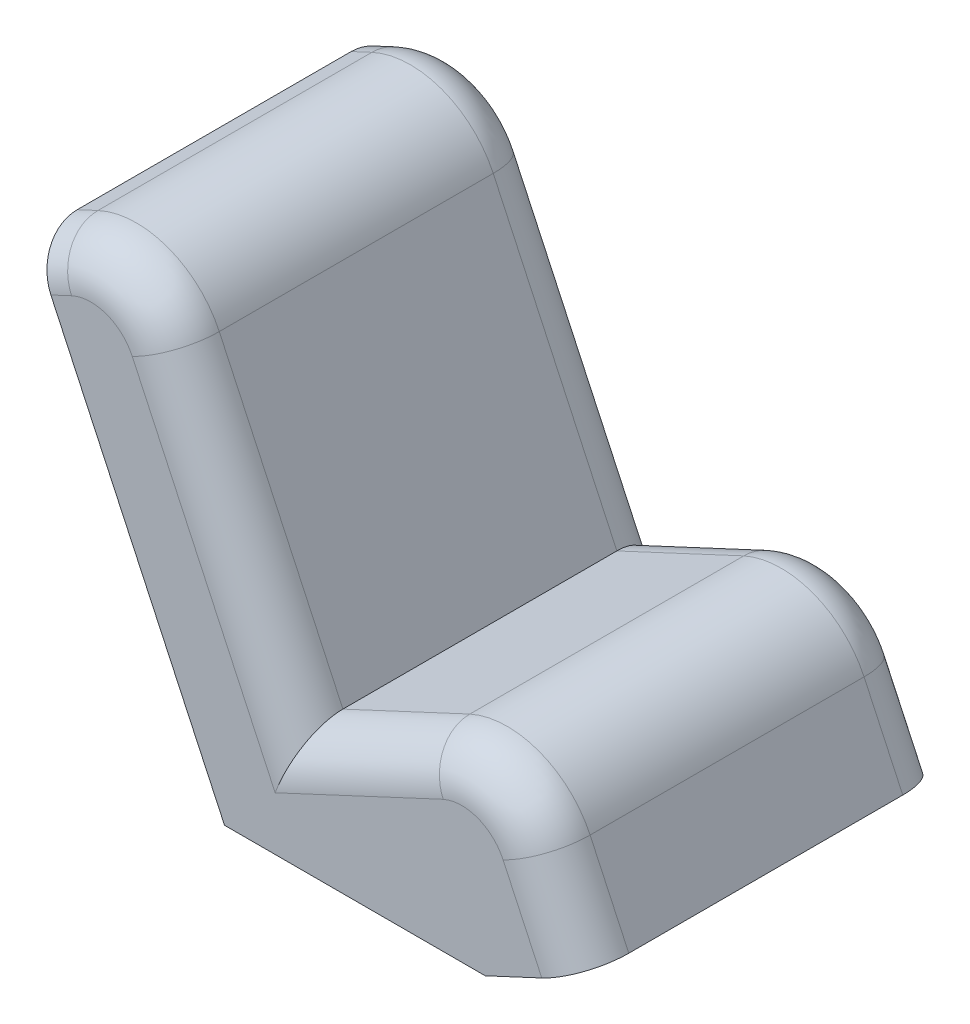
ISO-10303-21;
HEADER;
FILE_DESCRIPTION(('STEP AP214'),'2;1');
FILE_NAME('part.step','',(''),(''),'','','');
FILE_SCHEMA(('AUTOMOTIVE_DESIGN { 1 0 10303 214 1 1 1 1 }'));
ENDSEC;
DATA;
#1=APPLICATION_CONTEXT('core data for automotive mechanical design processes');
#2=APPLICATION_PROTOCOL_DEFINITION('international standard','automotive_design',2000,#1);
#3=PRODUCT_CONTEXT('',#1,'mechanical');
#4=PRODUCT('Part','Part','',(#3));
#5=PRODUCT_RELATED_PRODUCT_CATEGORY('part','',(#4));
#6=PRODUCT_DEFINITION_FORMATION('','',#4);
#7=PRODUCT_DEFINITION_CONTEXT('part definition',#1,'design');
#8=PRODUCT_DEFINITION('design','',#6,#7);
#9=PRODUCT_DEFINITION_SHAPE('','',#8);
#10=(LENGTH_UNIT() NAMED_UNIT(*) SI_UNIT(.MILLI.,.METRE.));
#11=(NAMED_UNIT(*) PLANE_ANGLE_UNIT() SI_UNIT($,.RADIAN.));
#12=(NAMED_UNIT(*) SI_UNIT($,.STERADIAN.) SOLID_ANGLE_UNIT());
#13=UNCERTAINTY_MEASURE_WITH_UNIT(LENGTH_MEASURE(1.E-05),#10,'distance_accuracy_value','');
#14=(GEOMETRIC_REPRESENTATION_CONTEXT(3) GLOBAL_UNCERTAINTY_ASSIGNED_CONTEXT((#13)) GLOBAL_UNIT_ASSIGNED_CONTEXT((#10,
#11,#12)) REPRESENTATION_CONTEXT('',''));
#15=CARTESIAN_POINT('',(0.,0.,0.));
#16=DIRECTION('',(0.,0.,1.));
#17=DIRECTION('',(1.,0.,0.));
#18=AXIS2_PLACEMENT_3D('',#15,#16,#17);
#19=CARTESIAN_POINT('',(-37.7302872388869,92.7438700123684,40.));
#20=DIRECTION('',(0.422618261740699,-0.90630778703665,0.));
#21=DIRECTION('',(0.90630778703665,0.422618261740699,0.));
#22=AXIS2_PLACEMENT_3D('',#19,#20,#21);
#23=PLANE('',#22);
#24=DIRECTION('',(0.,0.,-1.));
#25=VECTOR('',#24,1.);
#26=CARTESIAN_POINT('',(-37.7302872388869,92.7438700123684,40.));
#27=LINE('',#26,#25);
#28=CARTESIAN_POINT('',(-37.7302872388869,92.7438700123684,30.));
#29=VERTEX_POINT('',#28);
#30=CARTESIAN_POINT('',(-37.7302872388869,92.7438700123684,-30.));
#31=VERTEX_POINT('',#30);
#32=EDGE_CURVE('E199',#29,#31,#27,.T.);
#33=ORIENTED_EDGE('',*,*,#32,.T.);
#34=DIRECTION('',(-0.90630778703665,-0.422618261740699,0.));
#35=VECTOR('',#34,1.);
#36=CARTESIAN_POINT('',(-37.7302872388869,92.7438700123684,-30.));
#37=LINE('',#36,#35);
#38=CARTESIAN_POINT('',(-42.2618261740701,90.6307787036649,-30.));
#39=VERTEX_POINT('',#38);
#40=EDGE_CURVE('E269',#31,#39,#37,.T.);
#41=ORIENTED_EDGE('',*,*,#40,.T.);
#42=DIRECTION('',(0.,0.,-1.));
#43=VECTOR('',#42,1.);
#44=CARTESIAN_POINT('',(-42.2618261740701,90.6307787036649,40.));
#45=LINE('',#44,#43);
#46=CARTESIAN_POINT('',(-42.2618261740701,90.6307787036649,30.));
#47=VERTEX_POINT('',#46);
#48=EDGE_CURVE('E187',#47,#39,#45,.T.);
#49=ORIENTED_EDGE('',*,*,#48,.F.);
#50=DIRECTION('',(-0.90630778703665,-0.422618261740699,0.));
#51=VECTOR('',#50,1.);
#52=CARTESIAN_POINT('',(-37.7302872388869,92.7438700123684,30.));
#53=LINE('',#52,#51);
#54=EDGE_CURVE('E266',#47,#29,#53,.F.);
#55=ORIENTED_EDGE('',*,*,#54,.T.);
#56=EDGE_LOOP('',(#33,#41,#49,#55));
#57=FACE_BOUND('',#56,.T.);
#58=ADVANCED_FACE('F49',(#57),#23,.F.);
#59=CARTESIAN_POINT('',(-42.2618261740701,90.6307787036649,40.));
#60=DIRECTION('',(0.906307787036649,0.422618261740701,0.));
#61=DIRECTION('',(-0.422618261740701,0.906307787036649,0.));
#62=AXIS2_PLACEMENT_3D('',#59,#60,#61);
#63=PLANE('',#62);
#64=ORIENTED_EDGE('',*,*,#48,.T.);
#65=CARTESIAN_POINT('',(-38.0356435566631,81.5677008332984,-30.));
#66=DIRECTION('',(0.906307787036649,0.422618261740701,0.));
#67=DIRECTION('',(-0.422618261740701,0.906307787036649,0.));
#68=AXIS2_PLACEMENT_3D('',#65,#66,#67);
#69=CIRCLE('',#68,10.);
#70=CARTESIAN_POINT('',(-38.0356435566631,81.5677008332984,-40.));
#71=VERTEX_POINT('',#70);
#72=EDGE_CURVE('E275',#39,#71,#69,.F.);
#73=ORIENTED_EDGE('',*,*,#72,.T.);
#74=DIRECTION('',(0.422618261740701,-0.906307787036649,0.));
#75=VECTOR('',#74,1.);
#76=CARTESIAN_POINT('',(-42.2618261740701,90.6307787036649,-40.));
#77=LINE('',#76,#75);
#78=CARTESIAN_POINT('',(0.,0.,-40.));
#79=VERTEX_POINT('',#78);
#80=EDGE_CURVE('E183',#71,#79,#77,.T.);
#81=ORIENTED_EDGE('',*,*,#80,.T.);
#82=DIRECTION('',(0.,0.,-1.));
#83=VECTOR('',#82,1.);
#84=CARTESIAN_POINT('',(0.,0.,40.));
#85=LINE('',#84,#83);
#86=CARTESIAN_POINT('',(0.,0.,40.));
#87=VERTEX_POINT('',#86);
#88=EDGE_CURVE('E179',#87,#79,#85,.T.);
#89=ORIENTED_EDGE('',*,*,#88,.F.);
#90=DIRECTION('',(0.422618261740701,-0.906307787036649,0.));
#91=VECTOR('',#90,1.);
#92=CARTESIAN_POINT('',(-42.2618261740701,90.6307787036649,40.));
#93=LINE('',#92,#91);
#94=CARTESIAN_POINT('',(-38.0356435566631,81.5677008332984,40.));
#95=VERTEX_POINT('',#94);
#96=EDGE_CURVE('E164',#95,#87,#93,.T.);
#97=ORIENTED_EDGE('',*,*,#96,.F.);
#98=CARTESIAN_POINT('',(-38.0356435566631,81.5677008332984,30.));
#99=DIRECTION('',(0.906307787036649,0.422618261740701,0.));
#100=DIRECTION('',(-0.422618261740701,0.906307787036649,0.));
#101=AXIS2_PLACEMENT_3D('',#98,#99,#100);
#102=CIRCLE('',#101,10.);
#103=EDGE_CURVE('E272',#95,#47,#102,.F.);
#104=ORIENTED_EDGE('',*,*,#103,.T.);
#105=EDGE_LOOP('',(#64,#73,#81,#89,#97,#104));
#106=FACE_BOUND('',#105,.T.);
#107=ADVANCED_FACE('F181',(#106),#63,.F.);
#108=CARTESIAN_POINT('',(0.,0.,40.));
#109=DIRECTION('',(0.,1.,0.));
#110=DIRECTION('',(0.,0.,1.));
#111=AXIS2_PLACEMENT_3D('',#108,#109,#110);
#112=PLANE('',#111);
#113=CARTESIAN_POINT('',(30.,0.,0.));
#114=DIRECTION('',(0.,1.,0.));
#115=DIRECTION('',(0.,0.,1.));
#116=AXIS2_PLACEMENT_3D('',#113,#114,#115);
#117=CIRCLE('',#116,7.5);
#118=CARTESIAN_POINT('',(30.,0.,7.5));
#119=VERTEX_POINT('',#118);
#120=EDGE_CURVE('E237',#119,#119,#117,.F.);
#121=ORIENTED_EDGE('',*,*,#120,.F.);
#122=EDGE_LOOP('',(#121));
#123=FACE_BOUND('',#122,.T.);
#124=DIRECTION('',(1.,0.,0.));
#125=VECTOR('',#124,1.);
#126=CARTESIAN_POINT('',(0.,0.,-40.));
#127=LINE('',#126,#125);
#128=CARTESIAN_POINT('',(57.1,0.,-40.));
#129=VERTEX_POINT('',#128);
#130=EDGE_CURVE('E205',#79,#129,#127,.T.);
#131=ORIENTED_EDGE('',*,*,#130,.T.);
#132=DIRECTION('',(0.,0.,-1.));
#133=VECTOR('',#132,1.);
#134=CARTESIAN_POINT('',(57.1,0.,40.));
#135=LINE('',#134,#133);
#136=CARTESIAN_POINT('',(57.1,0.,40.));
#137=VERTEX_POINT('',#136);
#138=EDGE_CURVE('E188',#137,#129,#135,.T.);
#139=ORIENTED_EDGE('',*,*,#138,.F.);
#140=DIRECTION('',(1.,0.,0.));
#141=VECTOR('',#140,1.);
#142=CARTESIAN_POINT('',(0.,0.,40.));
#143=LINE('',#142,#141);
#144=EDGE_CURVE('E169',#87,#137,#143,.T.);
#145=ORIENTED_EDGE('',*,*,#144,.F.);
#146=ORIENTED_EDGE('',*,*,#88,.T.);
#147=EDGE_LOOP('',(#131,#139,#145,#146));
#148=FACE_BOUND('',#147,.T.);
#149=ADVANCED_FACE('F190',(#123,#148),#112,.F.);
#150=CARTESIAN_POINT('',(57.1,0.,40.));
#151=DIRECTION('',(-0.422618261740701,0.906307787036649,0.));
#152=DIRECTION('',(-0.906307787036649,-0.422618261740701,0.));
#153=AXIS2_PLACEMENT_3D('',#150,#151,#152);
#154=PLANE('',#153);
#155=DIRECTION('',(0.906307787036649,0.422618261740701,0.));
#156=VECTOR('',#155,1.);
#157=CARTESIAN_POINT('',(57.1,0.,-40.));
#158=LINE('',#157,#156);
#159=CARTESIAN_POINT('',(69.481991334729,5.77381738259299,-40.));
#160=VERTEX_POINT('',#159);
#161=EDGE_CURVE('E176',#129,#160,#158,.T.);
#162=ORIENTED_EDGE('',*,*,#161,.T.);
#163=CARTESIAN_POINT('',(69.481991334729,5.77381738259299,-30.));
#164=DIRECTION('',(-0.422618261740701,0.906307787036649,0.));
#165=DIRECTION('',(-0.906307787036649,-0.422618261740701,0.));
#166=AXIS2_PLACEMENT_3D('',#163,#164,#165);
#167=CIRCLE('',#166,10.);
#168=CARTESIAN_POINT('',(78.5450692050955,10.,-30.));
#169=VERTEX_POINT('',#168);
#170=EDGE_CURVE('E311',#160,#169,#167,.F.);
#171=ORIENTED_EDGE('',*,*,#170,.T.);
#172=DIRECTION('',(0.,0.,-1.));
#173=VECTOR('',#172,1.);
#174=CARTESIAN_POINT('',(78.5450692050955,10.,40.));
#175=LINE('',#174,#173);
#176=CARTESIAN_POINT('',(78.5450692050955,10.,30.));
#177=VERTEX_POINT('',#176);
#178=EDGE_CURVE('E229',#177,#169,#175,.T.);
#179=ORIENTED_EDGE('',*,*,#178,.F.);
#180=CARTESIAN_POINT('',(69.481991334729,5.77381738259299,30.));
#181=DIRECTION('',(-0.422618261740701,0.906307787036649,0.));
#182=DIRECTION('',(-0.906307787036649,-0.422618261740701,0.));
#183=AXIS2_PLACEMENT_3D('',#180,#181,#182);
#184=CIRCLE('',#183,10.);
#185=CARTESIAN_POINT('',(69.481991334729,5.77381738259299,40.));
#186=VERTEX_POINT('',#185);
#187=EDGE_CURVE('E308',#177,#186,#184,.F.);
#188=ORIENTED_EDGE('',*,*,#187,.T.);
#189=DIRECTION('',(0.906307787036649,0.422618261740701,0.));
#190=VECTOR('',#189,1.);
#191=CARTESIAN_POINT('',(57.1,0.,40.));
#192=LINE('',#191,#190);
#193=EDGE_CURVE('E194',#137,#186,#192,.T.);
#194=ORIENTED_EDGE('',*,*,#193,.F.);
#195=ORIENTED_EDGE('',*,*,#138,.T.);
#196=EDGE_LOOP('',(#162,#171,#179,#188,#194,#195));
#197=FACE_BOUND('',#196,.T.);
#198=ADVANCED_FACE('F448',(#197),#154,.F.);
#199=CARTESIAN_POINT('',(78.5450692050955,10.,40.));
#200=DIRECTION('',(-0.90630778703665,-0.422618261740699,0.));
#201=DIRECTION('',(0.422618261740699,-0.90630778703665,0.));
#202=AXIS2_PLACEMENT_3D('',#199,#200,#201);
#203=PLANE('',#202);
#204=ORIENTED_EDGE('',*,*,#178,.T.);
#205=DIRECTION('',(-0.422618261740699,0.90630778703665,0.));
#206=VECTOR('',#205,1.);
#207=CARTESIAN_POINT('',(78.5450692050955,10.,-30.));
#208=LINE('',#207,#206);
#209=CARTESIAN_POINT('',(70.0673164504015,28.1805994528102,-30.));
#210=VERTEX_POINT('',#209);
#211=EDGE_CURVE('E305',#169,#210,#208,.T.);
#212=ORIENTED_EDGE('',*,*,#211,.T.);
#213=DIRECTION('',(0.,0.,-1.));
#214=VECTOR('',#213,1.);
#215=CARTESIAN_POINT('',(70.0673164504015,28.1805994528102,40.));
#216=LINE('',#215,#214);
#217=CARTESIAN_POINT('',(70.0673164504015,28.1805994528102,30.));
#218=VERTEX_POINT('',#217);
#219=EDGE_CURVE('E225',#218,#210,#216,.T.);
#220=ORIENTED_EDGE('',*,*,#219,.F.);
#221=DIRECTION('',(-0.422618261740699,0.90630778703665,0.));
#222=VECTOR('',#221,1.);
#223=CARTESIAN_POINT('',(78.5450692050955,10.,30.));
#224=LINE('',#223,#222);
#225=EDGE_CURVE('E302',#218,#177,#224,.F.);
#226=ORIENTED_EDGE('',*,*,#225,.T.);
#227=EDGE_LOOP('',(#204,#212,#220,#226));
#228=FACE_BOUND('',#227,.T.);
#229=ADVANCED_FACE('F470',(#228),#203,.F.);
#230=CARTESIAN_POINT('',(51.9411607096685,19.7282342179962,40.));
#231=DIRECTION('',(0.,0.,-1.));
#232=DIRECTION('',(-1.,0.,0.));
#233=AXIS2_PLACEMENT_3D('',#230,#231,#232);
#234=CYLINDRICAL_SURFACE('',#233,20.);
#235=ORIENTED_EDGE('',*,*,#219,.T.);
#236=CARTESIAN_POINT('',(51.9411607096685,19.7282342179962,-30.));
#237=DIRECTION('',(0.,0.,1.));
#238=DIRECTION('',(1.,0.,0.));
#239=AXIS2_PLACEMENT_3D('',#236,#237,#238);
#240=CIRCLE('',#239,20.);
#241=CARTESIAN_POINT('',(43.7336019643533,37.9665449797471,-30.));
#242=VERTEX_POINT('',#241);
#243=EDGE_CURVE('E244',#210,#242,#240,.T.);
#244=ORIENTED_EDGE('',*,*,#243,.T.);
#245=DIRECTION('',(0.,0.,-1.));
#246=VECTOR('',#245,1.);
#247=CARTESIAN_POINT('',(43.7336019643533,37.9665449797471,40.));
#248=LINE('',#247,#246);
#249=CARTESIAN_POINT('',(43.7336019643533,37.9665449797471,30.));
#250=VERTEX_POINT('',#249);
#251=EDGE_CURVE('E222',#250,#242,#248,.T.);
#252=ORIENTED_EDGE('',*,*,#251,.F.);
#253=CARTESIAN_POINT('',(51.9411607096685,19.7282342179962,30.));
#254=DIRECTION('',(0.,0.,1.));
#255=DIRECTION('',(1.,0.,0.));
#256=AXIS2_PLACEMENT_3D('',#253,#254,#255);
#257=CIRCLE('',#256,20.);
#258=EDGE_CURVE('E241',#250,#218,#257,.F.);
#259=ORIENTED_EDGE('',*,*,#258,.T.);
#260=EDGE_LOOP('',(#235,#244,#252,#259));
#261=FACE_BOUND('',#260,.T.);
#262=ADVANCED_FACE('F467',(#261),#234,.T.);
#263=CARTESIAN_POINT('',(43.7336019643533,37.9665449797471,40.));
#264=DIRECTION('',(0.422618261740701,-0.906307787036649,0.));
#265=DIRECTION('',(0.906307787036649,0.422618261740701,0.));
#266=AXIS2_PLACEMENT_3D('',#263,#264,#265);
#267=PLANE('',#266);
#268=ORIENTED_EDGE('',*,*,#251,.T.);
#269=DIRECTION('',(-0.906307787036649,-0.422618261740701,0.));
#270=VECTOR('',#269,1.);
#271=CARTESIAN_POINT('',(43.7336019643533,37.9665449797471,-30.));
#272=LINE('',#271,#270);
#273=CARTESIAN_POINT('',(15.9267565201873,25.,-30.));
#274=VERTEX_POINT('',#273);
#275=EDGE_CURVE('E67',#242,#274,#272,.T.);
#276=ORIENTED_EDGE('',*,*,#275,.T.);
#277=DIRECTION('',(0.,0.,-1.));
#278=VECTOR('',#277,1.);
#279=CARTESIAN_POINT('',(15.9267565201873,25.,40.));
#280=LINE('',#279,#278);
#281=CARTESIAN_POINT('',(15.9267565201873,25.,30.));
#282=VERTEX_POINT('',#281);
#283=EDGE_CURVE('E219',#282,#274,#280,.T.);
#284=ORIENTED_EDGE('',*,*,#283,.F.);
#285=DIRECTION('',(-0.906307787036649,-0.422618261740701,0.));
#286=VECTOR('',#285,1.);
#287=CARTESIAN_POINT('',(43.7336019643533,37.9665449797471,30.));
#288=LINE('',#287,#286);
#289=EDGE_CURVE('E314',#282,#250,#288,.F.);
#290=ORIENTED_EDGE('',*,*,#289,.T.);
#291=EDGE_LOOP('',(#268,#276,#284,#290));
#292=FACE_BOUND('',#291,.T.);
#293=ADVANCED_FACE('F465',(#292),#267,.F.);
#294=CARTESIAN_POINT('',(15.9267565201873,25.,40.));
#295=DIRECTION('',(-0.906307787036649,-0.422618261740701,0.));
#296=DIRECTION('',(0.422618261740701,-0.906307787036649,0.));
#297=AXIS2_PLACEMENT_3D('',#294,#295,#296);
#298=PLANE('',#297);
#299=ORIENTED_EDGE('',*,*,#283,.T.);
#300=DIRECTION('',(-0.422618261740701,0.906307787036649,0.));
#301=VECTOR('',#300,1.);
#302=CARTESIAN_POINT('',(15.9267565201873,25.,-30.));
#303=LINE('',#302,#301);
#304=CARTESIAN_POINT('',(-11.1517662633399,83.0700795064495,-30.));
#305=VERTEX_POINT('',#304);
#306=EDGE_CURVE('E11',#274,#305,#303,.T.);
#307=ORIENTED_EDGE('',*,*,#306,.T.);
#308=DIRECTION('',(0.,0.,-1.));
#309=VECTOR('',#308,1.);
#310=CARTESIAN_POINT('',(-11.1517662633399,83.0700795064495,40.));
#311=LINE('',#310,#309);
#312=CARTESIAN_POINT('',(-11.1517662633399,83.0700795064495,30.));
#313=VERTEX_POINT('',#312);
#314=EDGE_CURVE('E215',#313,#305,#311,.T.);
#315=ORIENTED_EDGE('',*,*,#314,.F.);
#316=DIRECTION('',(-0.422618261740701,0.906307787036649,0.));
#317=VECTOR('',#316,1.);
#318=CARTESIAN_POINT('',(15.9267565201873,25.,30.));
#319=LINE('',#318,#317);
#320=EDGE_CURVE('E59',#313,#282,#319,.F.);
#321=ORIENTED_EDGE('',*,*,#320,.T.);
#322=EDGE_LOOP('',(#299,#307,#315,#321));
#323=FACE_BOUND('',#322,.T.);
#324=ADVANCED_FACE('F509',(#323),#298,.F.);
#325=CARTESIAN_POINT('',(-29.2779220040729,74.6177142716354,40.));
#326=DIRECTION('',(0.,0.,-1.));
#327=DIRECTION('',(-1.,0.,0.));
#328=AXIS2_PLACEMENT_3D('',#325,#326,#327);
#329=CYLINDRICAL_SURFACE('',#328,20.);
#330=ORIENTED_EDGE('',*,*,#314,.T.);
#331=CARTESIAN_POINT('',(-29.2779220040729,74.6177142716354,-30.));
#332=DIRECTION('',(0.,0.,1.));
#333=DIRECTION('',(1.,0.,0.));
#334=AXIS2_PLACEMENT_3D('',#331,#332,#333);
#335=CIRCLE('',#334,20.);
#336=EDGE_CURVE('E281',#305,#31,#335,.T.);
#337=ORIENTED_EDGE('',*,*,#336,.T.);
#338=ORIENTED_EDGE('',*,*,#32,.F.);
#339=CARTESIAN_POINT('',(-29.2779220040729,74.6177142716354,30.));
#340=DIRECTION('',(0.,0.,1.));
#341=DIRECTION('',(1.,0.,0.));
#342=AXIS2_PLACEMENT_3D('',#339,#340,#341);
#343=CIRCLE('',#342,20.);
#344=EDGE_CURVE('E278',#29,#313,#343,.F.);
#345=ORIENTED_EDGE('',*,*,#344,.T.);
#346=EDGE_LOOP('',(#330,#337,#338,#345));
#347=FACE_BOUND('',#346,.T.);
#348=ADVANCED_FACE('F505',(#347),#329,.T.);
#349=CARTESIAN_POINT('',(51.9411607096685,19.7282342179962,40.));
#350=DIRECTION('',(0.,0.,1.));
#351=DIRECTION('',(1.,0.,0.));
#352=AXIS2_PLACEMENT_3D('',#349,#350,#351);
#353=PLANE('',#352);
#354=ORIENTED_EDGE('',*,*,#193,.T.);
#355=DIRECTION('',(-0.422618261740699,0.90630778703665,0.));
#356=VECTOR('',#355,1.);
#357=CARTESIAN_POINT('',(61.004238580035,23.9544168354032,40.));
#358=LINE('',#357,#356);
#359=CARTESIAN_POINT('',(61.004238580035,23.9544168354032,40.));
#360=VERTEX_POINT('',#359);
#361=EDGE_CURVE('E299',#186,#360,#358,.T.);
#362=ORIENTED_EDGE('',*,*,#361,.T.);
#363=CARTESIAN_POINT('',(51.9411607096685,19.7282342179962,40.));
#364=DIRECTION('',(0.,0.,1.));
#365=DIRECTION('',(1.,0.,0.));
#366=AXIS2_PLACEMENT_3D('',#363,#364,#365);
#367=CIRCLE('',#366,9.99999999999999);
#368=CARTESIAN_POINT('',(47.8883028934,28.8701346506804,40.));
#369=VERTEX_POINT('',#368);
#370=EDGE_CURVE('E295',#360,#369,#367,.T.);
#371=ORIENTED_EDGE('',*,*,#370,.T.);
#372=DIRECTION('',(-0.906307787036649,-0.422618261740701,0.));
#373=VECTOR('',#372,1.);
#374=CARTESIAN_POINT('',(20.1529391375943,15.9369221296335,40.));
#375=LINE('',#374,#373);
#376=CARTESIAN_POINT('',(11.0898612672278,11.7107395122265,40.));
#377=VERTEX_POINT('',#376);
#378=EDGE_CURVE('E287',#369,#377,#375,.T.);
#379=ORIENTED_EDGE('',*,*,#378,.T.);
#380=DIRECTION('',(-0.422618261740701,0.906307787036649,0.));
#381=VECTOR('',#380,1.);
#382=CARTESIAN_POINT('',(-20.2148441337063,78.8438968890425,40.));
#383=LINE('',#382,#381);
#384=CARTESIAN_POINT('',(-20.2148441337063,78.8438968890425,40.));
#385=VERTEX_POINT('',#384);
#386=EDGE_CURVE('E284',#377,#385,#383,.T.);
#387=ORIENTED_EDGE('',*,*,#386,.T.);
#388=CARTESIAN_POINT('',(-29.2779220040729,74.6177142716354,40.));
#389=DIRECTION('',(0.,0.,1.));
#390=DIRECTION('',(1.,0.,0.));
#391=AXIS2_PLACEMENT_3D('',#388,#389,#390);
#392=CIRCLE('',#391,10.);
#393=CARTESIAN_POINT('',(-33.5041046214799,83.6807921420019,40.));
#394=VERTEX_POINT('',#393);
#395=EDGE_CURVE('E290',#385,#394,#392,.T.);
#396=ORIENTED_EDGE('',*,*,#395,.T.);
#397=DIRECTION('',(-0.90630778703665,-0.422618261740699,0.));
#398=VECTOR('',#397,1.);
#399=CARTESIAN_POINT('',(-38.0356435566631,81.5677008332984,40.));
#400=LINE('',#399,#398);
#401=EDGE_CURVE('E172',#394,#95,#400,.T.);
#402=ORIENTED_EDGE('',*,*,#401,.T.);
#403=ORIENTED_EDGE('',*,*,#96,.T.);
#404=ORIENTED_EDGE('',*,*,#144,.T.);
#405=EDGE_LOOP('',(#354,#362,#371,#379,#387,#396,#402,#403,#404));
#406=FACE_BOUND('',#405,.T.);
#407=ADVANCED_FACE('F167',(#406),#353,.T.);
#408=CARTESIAN_POINT('',(51.9411607096685,19.7282342179962,-40.));
#409=DIRECTION('',(0.,0.,1.));
#410=DIRECTION('',(1.,0.,0.));
#411=AXIS2_PLACEMENT_3D('',#408,#409,#410);
#412=PLANE('',#411);
#413=CARTESIAN_POINT('',(51.9411607096685,19.7282342179962,-40.));
#414=DIRECTION('',(0.,0.,1.));
#415=DIRECTION('',(1.,0.,0.));
#416=AXIS2_PLACEMENT_3D('',#413,#414,#415);
#417=CIRCLE('',#416,9.99999999999999);
#418=CARTESIAN_POINT('',(47.8883028934001,28.8701346506804,-40.));
#419=VERTEX_POINT('',#418);
#420=CARTESIAN_POINT('',(61.004238580035,23.9544168354032,-40.));
#421=VERTEX_POINT('',#420);
#422=EDGE_CURVE('E260',#419,#421,#417,.F.);
#423=ORIENTED_EDGE('',*,*,#422,.T.);
#424=DIRECTION('',(-0.422618261740699,0.90630778703665,0.));
#425=VECTOR('',#424,1.);
#426=CARTESIAN_POINT('',(61.004238580035,23.9544168354032,-40.));
#427=LINE('',#426,#425);
#428=EDGE_CURVE('E263',#421,#160,#427,.F.);
#429=ORIENTED_EDGE('',*,*,#428,.T.);
#430=ORIENTED_EDGE('',*,*,#161,.F.);
#431=ORIENTED_EDGE('',*,*,#130,.F.);
#432=ORIENTED_EDGE('',*,*,#80,.F.);
#433=DIRECTION('',(-0.90630778703665,-0.422618261740699,0.));
#434=VECTOR('',#433,1.);
#435=CARTESIAN_POINT('',(12.1848561642503,104.985904449531,-40.));
#436=LINE('',#435,#434);
#437=CARTESIAN_POINT('',(-33.5041046214799,83.6807921420019,-40.));
#438=VERTEX_POINT('',#437);
#439=EDGE_CURVE('E257',#71,#438,#436,.F.);
#440=ORIENTED_EDGE('',*,*,#439,.T.);
#441=CARTESIAN_POINT('',(-29.2779220040729,74.6177142716354,-40.));
#442=DIRECTION('',(0.,0.,1.));
#443=DIRECTION('',(1.,0.,0.));
#444=AXIS2_PLACEMENT_3D('',#441,#442,#443);
#445=CIRCLE('',#444,10.);
#446=CARTESIAN_POINT('',(-20.2148441337063,78.8438968890425,-40.));
#447=VERTEX_POINT('',#446);
#448=EDGE_CURVE('E254',#438,#447,#445,.F.);
#449=ORIENTED_EDGE('',*,*,#448,.T.);
#450=DIRECTION('',(-0.422618261740701,0.906307787036649,0.));
#451=VECTOR('',#450,1.);
#452=CARTESIAN_POINT('',(15.3152777943051,2.64930452787383,-40.));
#453=LINE('',#452,#451);
#454=CARTESIAN_POINT('',(11.0898612672278,11.7107395122265,-40.));
#455=VERTEX_POINT('',#454);
#456=EDGE_CURVE('E248',#447,#455,#453,.F.);
#457=ORIENTED_EDGE('',*,*,#456,.T.);
#458=DIRECTION('',(-0.906307787036649,-0.422618261740701,0.));
#459=VECTOR('',#458,1.);
#460=CARTESIAN_POINT('',(47.7157441825912,28.7896692023489,-40.));
#461=LINE('',#460,#459);
#462=EDGE_CURVE('E251',#455,#419,#461,.F.);
#463=ORIENTED_EDGE('',*,*,#462,.T.);
#464=EDGE_LOOP('',(#423,#429,#430,#431,#432,#440,#449,#457,#463));
#465=FACE_BOUND('',#464,.T.);
#466=ADVANCED_FACE('F446',(#465),#412,.F.);
#467=CARTESIAN_POINT('',(30.,-5.00000000000001,0.));
#468=DIRECTION('',(0.,1.,0.));
#469=DIRECTION('',(0.,0.,1.));
#470=AXIS2_PLACEMENT_3D('',#467,#468,#469);
#471=CYLINDRICAL_SURFACE('',#470,7.5);
#472=CARTESIAN_POINT('',(30.,-5.00000000000001,0.));
#473=DIRECTION('',(0.,-1.,0.));
#474=DIRECTION('',(0.,0.,-1.));
#475=AXIS2_PLACEMENT_3D('',#472,#473,#474);
#476=CIRCLE('',#475,7.5);
#477=CARTESIAN_POINT('',(30.,-5.00000000000001,-7.5));
#478=VERTEX_POINT('',#477);
#479=EDGE_CURVE('E206',#478,#478,#476,.T.);
#480=ORIENTED_EDGE('',*,*,#479,.F.);
#481=EDGE_LOOP('',(#480));
#482=FACE_BOUND('',#481,.T.);
#483=ORIENTED_EDGE('',*,*,#120,.T.);
#484=EDGE_LOOP('',(#483));
#485=FACE_BOUND('',#484,.T.);
#486=ADVANCED_FACE('F493',(#482,#485),#471,.T.);
#487=CARTESIAN_POINT('',(30.,-5.00000000000001,0.));
#488=DIRECTION('',(0.,-1.,0.));
#489=DIRECTION('',(0.,0.,-1.));
#490=AXIS2_PLACEMENT_3D('',#487,#488,#489);
#491=PLANE('',#490);
#492=ORIENTED_EDGE('',*,*,#479,.T.);
#493=EDGE_LOOP('',(#492));
#494=FACE_BOUND('',#493,.T.);
#495=ADVANCED_FACE('F355',(#494),#491,.T.);
#496=CARTESIAN_POINT('',(-33.5041046214799,83.6807921420019,-30.));
#497=DIRECTION('',(-0.90630778703665,-0.422618261740699,0.));
#498=DIRECTION('',(0.422618261740699,-0.90630778703665,0.));
#499=AXIS2_PLACEMENT_3D('',#496,#497,#498);
#500=CYLINDRICAL_SURFACE('',#499,10.);
#501=ORIENTED_EDGE('',*,*,#72,.F.);
#502=ORIENTED_EDGE('',*,*,#40,.F.);
#503=CARTESIAN_POINT('',(-33.5041046214799,83.6807921420019,-30.));
#504=DIRECTION('',(0.90630778703665,0.422618261740699,0.));
#505=DIRECTION('',(-0.422618261740699,0.90630778703665,0.));
#506=AXIS2_PLACEMENT_3D('',#503,#504,#505);
#507=CIRCLE('',#506,10.);
#508=EDGE_CURVE('E375',#438,#31,#507,.T.);
#509=ORIENTED_EDGE('',*,*,#508,.F.);
#510=ORIENTED_EDGE('',*,*,#439,.F.);
#511=EDGE_LOOP('',(#501,#502,#509,#510));
#512=FACE_BOUND('',#511,.T.);
#513=ADVANCED_FACE('F351',(#512),#500,.T.);
#514=CARTESIAN_POINT('',(-29.2779220040729,74.6177142716354,-30.));
#515=DIRECTION('',(0.,0.,1.));
#516=DIRECTION('',(1.,0.,0.));
#517=AXIS2_PLACEMENT_3D('',#514,#515,#516);
#518=TOROIDAL_SURFACE('',#517,10.,10.);
#519=ORIENTED_EDGE('',*,*,#508,.T.);
#520=ORIENTED_EDGE('',*,*,#336,.F.);
#521=CARTESIAN_POINT('',(-20.2148441337064,78.8438968890425,-30.));
#522=DIRECTION('',(0.422618261740701,-0.906307787036649,0.));
#523=DIRECTION('',(0.906307787036649,0.422618261740701,0.));
#524=AXIS2_PLACEMENT_3D('',#521,#522,#523);
#525=CIRCLE('',#524,10.);
#526=EDGE_CURVE('E415',#447,#305,#525,.T.);
#527=ORIENTED_EDGE('',*,*,#526,.F.);
#528=ORIENTED_EDGE('',*,*,#448,.F.);
#529=EDGE_LOOP('',(#519,#520,#527,#528));
#530=FACE_BOUND('',#529,.T.);
#531=ADVANCED_FACE('F347',(#530),#518,.T.);
#532=CARTESIAN_POINT('',(6.86367864982078,20.773817382593,-30.));
#533=DIRECTION('',(-0.422618261740701,0.906307787036649,0.));
#534=DIRECTION('',(-0.906307787036649,-0.422618261740701,0.));
#535=AXIS2_PLACEMENT_3D('',#532,#533,#534);
#536=CYLINDRICAL_SURFACE('',#535,10.);
#537=ORIENTED_EDGE('',*,*,#526,.T.);
#538=ORIENTED_EDGE('',*,*,#306,.F.);
#539=CARTESIAN_POINT('',(11.0898612672278,11.7107395122265,-30.));
#540=DIRECTION('',(-0.939692620785909,0.342020143325667,0.));
#541=DIRECTION('',(-0.342020143325667,-0.939692620785909,0.));
#542=AXIS2_PLACEMENT_3D('',#539,#540,#541);
#543=ELLIPSE('',#542,14.142135623731,10.);
#544=EDGE_CURVE('E421',#455,#274,#543,.F.);
#545=ORIENTED_EDGE('',*,*,#544,.F.);
#546=ORIENTED_EDGE('',*,*,#456,.F.);
#547=EDGE_LOOP('',(#537,#538,#545,#546));
#548=FACE_BOUND('',#547,.T.);
#549=ADVANCED_FACE('F343',(#548),#536,.T.);
#550=CARTESIAN_POINT('',(69.481991334729,5.77381738259301,-30.));
#551=DIRECTION('',(-0.422618261740699,0.90630778703665,0.));
#552=DIRECTION('',(-0.90630778703665,-0.422618261740699,0.));
#553=AXIS2_PLACEMENT_3D('',#550,#551,#552);
#554=CYLINDRICAL_SURFACE('',#553,10.);
#555=ORIENTED_EDGE('',*,*,#170,.F.);
#556=ORIENTED_EDGE('',*,*,#428,.F.);
#557=CARTESIAN_POINT('',(61.004238580035,23.9544168354032,-30.));
#558=DIRECTION('',(-0.422618261740699,0.90630778703665,0.));
#559=DIRECTION('',(-0.90630778703665,-0.422618261740699,0.));
#560=AXIS2_PLACEMENT_3D('',#557,#558,#559);
#561=CIRCLE('',#560,10.);
#562=EDGE_CURVE('E330',#210,#421,#561,.T.);
#563=ORIENTED_EDGE('',*,*,#562,.F.);
#564=ORIENTED_EDGE('',*,*,#211,.F.);
#565=EDGE_LOOP('',(#555,#556,#563,#564));
#566=FACE_BOUND('',#565,.T.);
#567=ADVANCED_FACE('F340',(#566),#554,.T.);
#568=CARTESIAN_POINT('',(47.9597845817603,28.9034671093806,-30.));
#569=DIRECTION('',(-0.906307787036649,-0.422618261740701,0.));
#570=DIRECTION('',(0.422618261740701,-0.906307787036649,0.));
#571=AXIS2_PLACEMENT_3D('',#568,#569,#570);
#572=CYLINDRICAL_SURFACE('',#571,10.);
#573=ORIENTED_EDGE('',*,*,#544,.T.);
#574=ORIENTED_EDGE('',*,*,#275,.F.);
#575=CARTESIAN_POINT('',(43.7336019643533,37.9665449797471,-30.));
#576=CARTESIAN_POINT('',(43.7335892283689,37.9665724086196,-30.2812460770922));
#577=CARTESIAN_POINT('',(43.7385433635963,37.9557591198525,-30.5624878008947));
#578=CARTESIAN_POINT('',(43.7582934000026,37.9126492265315,-31.1229591730182));
#579=CARTESIAN_POINT('',(43.7730888299987,37.8803536505096,-31.4021889170221));
#580=CARTESIAN_POINT('',(43.8124159476658,37.794506841098,-31.9564693221144));
#581=CARTESIAN_POINT('',(43.8369409223773,37.7409702630665,-32.2315227291225));
#582=CARTESIAN_POINT('',(43.8955467106243,37.6130300991628,-32.7756904982143));
#583=CARTESIAN_POINT('',(43.9296274078361,37.5386267673055,-33.0448049325513));
#584=CARTESIAN_POINT('',(44.0071193492217,37.3694378430067,-33.5753116986681));
#585=CARTESIAN_POINT('',(44.0505349991628,37.2746426263074,-33.8367003176473));
#586=CARTESIAN_POINT('',(44.1463758353265,37.0653616747348,-34.3497692673198));
#587=CARTESIAN_POINT('',(44.1988012119523,36.9508755237315,-34.6014493927052));
#588=CARTESIAN_POINT('',(44.3122700184689,36.7030564749614,-35.0932457454105));
#589=CARTESIAN_POINT('',(44.3733113415706,36.5697281845037,-35.3333647804796));
#590=CARTESIAN_POINT('',(44.5035824408614,36.2851500978789,-35.8003967410648));
#591=CARTESIAN_POINT('',(44.5728121707733,36.1339004029954,-36.0273097412045));
#592=CARTESIAN_POINT('',(44.7189597950502,35.8145574354605,-36.4663100558356));
#593=CARTESIAN_POINT('',(44.7958773978752,35.6464648015275,-36.6783979320083));
#594=CARTESIAN_POINT('',(44.9568498305863,35.2946229478113,-37.0862502760534));
#595=CARTESIAN_POINT('',(45.0409046612295,35.1108737263674,-37.2820147421941));
#596=CARTESIAN_POINT('',(45.2155770514665,34.728955662208,-37.6558934187663));
#597=CARTESIAN_POINT('',(45.3061968567422,34.5307818851717,-37.8340015396752));
#598=CARTESIAN_POINT('',(45.4933194654909,34.1214803301292,-38.171221305032));
#599=CARTESIAN_POINT('',(45.5898221577279,33.910352797057,-38.3303333084976));
#600=CARTESIAN_POINT('',(45.7880485686033,33.4765693277255,-38.6284804213827));
#601=CARTESIAN_POINT('',(45.889773919755,33.2539097865655,-38.7675092007033));
#602=CARTESIAN_POINT('',(46.0976822303708,32.7987087495134,-39.0244386127809));
#603=CARTESIAN_POINT('',(46.2038651071677,32.5661674368832,-39.1423396371505));
#604=CARTESIAN_POINT('',(46.419848324785,32.0930166039715,-39.3561013804707));
#605=CARTESIAN_POINT('',(46.5296459969385,31.8524130335136,-39.451977959799));
#606=CARTESIAN_POINT('',(46.7521008613735,31.364770996103,-39.6210907468428));
#607=CARTESIAN_POINT('',(46.8647571746039,31.1177345067175,-39.6943338253611));
#608=CARTESIAN_POINT('',(47.1180776853112,30.5620289884929,-39.8317614777979));
#609=CARTESIAN_POINT('',(47.2592757409941,30.2521401074889,-39.8900812203157));
#610=CARTESIAN_POINT('',(47.5431001854821,29.6288832189662,-39.9711504323302));
#611=CARTESIAN_POINT('',(47.6857240340748,29.315521317831,-39.9939546502428));
#612=CARTESIAN_POINT('',(47.8483000640673,28.9580937978637,-39.9996504437174));
#613=CARTESIAN_POINT('',(47.8683031962846,28.9141124628924,-40.0000006767459));
#614=CARTESIAN_POINT('',(47.8883028933999,28.8701346506803,-40.));
#615=B_SPLINE_CURVE_WITH_KNOTS('',3,(#575,#576,#577,#578,#579,#580,#581,#582,#583,#584,#585,
#586,#587,#588,#589,#590,#591,#592,#593,#594,#595,#596,#597,#598,#599,#600,#601,#602,#603,#604,
#605,#606,#607,#608,#609,#610,#611,#612,#613,#614),.UNSPECIFIED.,.F.,.F.,(4,2,2,2,2,2,2,2,2,2,2,
2,2,2,2,2,2,2,2,4),(0.,0.843480691126025,1.68692100087349,2.5297803830351,3.37262950535717,
4.21587729925029,5.05914291575326,5.90220269127255,6.7452577024368,7.58828075533675,
8.43130389766051,9.27461678722266,10.1179137360385,10.9614759091825,11.8050224449042,
12.6479596030271,13.4906406205985,14.5252945566703,15.558351953449,15.7032994809851),.UNSPECIFIED.);
#616=EDGE_CURVE('E321',#419,#242,#615,.F.);
#617=ORIENTED_EDGE('',*,*,#616,.F.);
#618=ORIENTED_EDGE('',*,*,#462,.F.);
#619=EDGE_LOOP('',(#573,#574,#617,#618));
#620=FACE_BOUND('',#619,.T.);
#621=ADVANCED_FACE('F332',(#620),#572,.T.);
#622=CARTESIAN_POINT('',(51.9411607096685,19.7282342179962,-30.));
#623=DIRECTION('',(0.,0.,1.));
#624=DIRECTION('',(1.,0.,0.));
#625=AXIS2_PLACEMENT_3D('',#622,#623,#624);
#626=DEGENERATE_TOROIDAL_SURFACE('',#625,9.99999999999999,10.,.T.);
#627=ORIENTED_EDGE('',*,*,#562,.T.);
#628=ORIENTED_EDGE('',*,*,#422,.F.);
#629=ORIENTED_EDGE('',*,*,#616,.T.);
#630=ORIENTED_EDGE('',*,*,#243,.F.);
#631=EDGE_LOOP('',(#627,#628,#629,#630));
#632=FACE_BOUND('',#631,.T.);
#633=ADVANCED_FACE('F335',(#632),#626,.T.);
#634=CARTESIAN_POINT('',(12.1848561642503,104.985904449531,30.));
#635=DIRECTION('',(0.90630778703665,0.422618261740699,0.));
#636=DIRECTION('',(-0.422618261740699,0.90630778703665,0.));
#637=AXIS2_PLACEMENT_3D('',#634,#635,#636);
#638=CYLINDRICAL_SURFACE('',#637,10.);
#639=ORIENTED_EDGE('',*,*,#103,.F.);
#640=ORIENTED_EDGE('',*,*,#401,.F.);
#641=CARTESIAN_POINT('',(-33.5041046214799,83.6807921420019,30.));
#642=DIRECTION('',(0.90630778703665,0.422618261740699,0.));
#643=DIRECTION('',(-0.422618261740699,0.90630778703665,0.));
#644=AXIS2_PLACEMENT_3D('',#641,#642,#643);
#645=CIRCLE('',#644,10.);
#646=EDGE_CURVE('E53',#29,#394,#645,.T.);
#647=ORIENTED_EDGE('',*,*,#646,.F.);
#648=ORIENTED_EDGE('',*,*,#54,.F.);
#649=EDGE_LOOP('',(#639,#640,#647,#648));
#650=FACE_BOUND('',#649,.T.);
#651=ADVANCED_FACE('F51',(#650),#638,.T.);
#652=CARTESIAN_POINT('',(-29.2779220040729,74.6177142716354,30.));
#653=DIRECTION('',(0.,0.,1.));
#654=DIRECTION('',(1.,0.,0.));
#655=AXIS2_PLACEMENT_3D('',#652,#653,#654);
#656=TOROIDAL_SURFACE('',#655,10.,10.);
#657=ORIENTED_EDGE('',*,*,#646,.T.);
#658=ORIENTED_EDGE('',*,*,#395,.F.);
#659=CARTESIAN_POINT('',(-20.2148441337064,78.8438968890425,30.));
#660=DIRECTION('',(0.422618261740701,-0.906307787036649,0.));
#661=DIRECTION('',(0.906307787036649,0.422618261740701,0.));
#662=AXIS2_PLACEMENT_3D('',#659,#660,#661);
#663=CIRCLE('',#662,10.);
#664=EDGE_CURVE('E383',#313,#385,#663,.T.);
#665=ORIENTED_EDGE('',*,*,#664,.F.);
#666=ORIENTED_EDGE('',*,*,#344,.F.);
#667=EDGE_LOOP('',(#657,#658,#665,#666));
#668=FACE_BOUND('',#667,.T.);
#669=ADVANCED_FACE('F399',(#668),#656,.T.);
#670=CARTESIAN_POINT('',(15.3152777943051,2.64930452787383,30.));
#671=DIRECTION('',(0.422618261740701,-0.906307787036649,0.));
#672=DIRECTION('',(0.906307787036649,0.422618261740701,0.));
#673=AXIS2_PLACEMENT_3D('',#670,#671,#672);
#674=CYLINDRICAL_SURFACE('',#673,10.);
#675=ORIENTED_EDGE('',*,*,#664,.T.);
#676=ORIENTED_EDGE('',*,*,#386,.F.);
#677=CARTESIAN_POINT('',(11.0898612672278,11.7107395122265,30.));
#678=DIRECTION('',(0.939692620785909,-0.342020143325667,0.));
#679=DIRECTION('',(0.342020143325667,0.939692620785909,0.));
#680=AXIS2_PLACEMENT_3D('',#677,#678,#679);
#681=ELLIPSE('',#680,14.142135623731,10.);
#682=EDGE_CURVE('E380',#282,#377,#681,.T.);
#683=ORIENTED_EDGE('',*,*,#682,.F.);
#684=ORIENTED_EDGE('',*,*,#320,.F.);
#685=EDGE_LOOP('',(#675,#676,#683,#684));
#686=FACE_BOUND('',#685,.T.);
#687=ADVANCED_FACE('F462',(#686),#674,.T.);
#688=CARTESIAN_POINT('',(61.004238580035,23.9544168354032,30.));
#689=DIRECTION('',(0.422618261740699,-0.90630778703665,0.));
#690=DIRECTION('',(0.90630778703665,0.422618261740699,0.));
#691=AXIS2_PLACEMENT_3D('',#688,#689,#690);
#692=CYLINDRICAL_SURFACE('',#691,10.);
#693=ORIENTED_EDGE('',*,*,#187,.F.);
#694=ORIENTED_EDGE('',*,*,#225,.F.);
#695=CARTESIAN_POINT('',(61.004238580035,23.9544168354032,30.));
#696=DIRECTION('',(-0.4226182617407,0.90630778703665,0.));
#697=DIRECTION('',(-0.90630778703665,-0.4226182617407,0.));
#698=AXIS2_PLACEMENT_3D('',#695,#696,#697);
#699=CIRCLE('',#698,10.);
#700=EDGE_CURVE('E374',#360,#218,#699,.T.);
#701=ORIENTED_EDGE('',*,*,#700,.F.);
#702=ORIENTED_EDGE('',*,*,#361,.F.);
#703=EDGE_LOOP('',(#693,#694,#701,#702));
#704=FACE_BOUND('',#703,.T.);
#705=ADVANCED_FACE('F454',(#704),#692,.T.);
#706=CARTESIAN_POINT('',(47.7157441825912,28.7896692023489,30.));
#707=DIRECTION('',(0.906307787036649,0.422618261740701,0.));
#708=DIRECTION('',(-0.422618261740701,0.906307787036649,0.));
#709=AXIS2_PLACEMENT_3D('',#706,#707,#708);
#710=CYLINDRICAL_SURFACE('',#709,10.);
#711=ORIENTED_EDGE('',*,*,#682,.T.);
#712=ORIENTED_EDGE('',*,*,#378,.F.);
#713=CARTESIAN_POINT('',(43.7336019643533,37.9665449797471,30.));
#714=CARTESIAN_POINT('',(43.7335892283688,37.9665724086196,30.2812460770922));
#715=CARTESIAN_POINT('',(43.7385433635962,37.9557591198525,30.5624878008947));
#716=CARTESIAN_POINT('',(43.7582934000024,37.9126492265315,31.1229591730182));
#717=CARTESIAN_POINT('',(43.7730888299985,37.8803536505095,31.4021889170221));
#718=CARTESIAN_POINT('',(43.8124159476655,37.7945068410979,31.9564693221144));
#719=CARTESIAN_POINT('',(43.8369409223771,37.7409702630664,32.2315227291224));
#720=CARTESIAN_POINT('',(43.8955467106241,37.6130300991627,32.7756904982143));
#721=CARTESIAN_POINT('',(43.929627407836,37.5386267673055,33.0448049325513));
#722=CARTESIAN_POINT('',(44.0071193492218,37.3694378430068,33.575311698668));
#723=CARTESIAN_POINT('',(44.0505349991629,37.2746426263074,33.8367003176473));
#724=CARTESIAN_POINT('',(44.1463758353265,37.0653616747348,34.3497692673198));
#725=CARTESIAN_POINT('',(44.1988012119521,36.9508755237314,34.6014493927052));
#726=CARTESIAN_POINT('',(44.3122700184687,36.7030564749613,35.0932457454105));
#727=CARTESIAN_POINT('',(44.3733113415707,36.5697281845037,35.3333647804796));
#728=CARTESIAN_POINT('',(44.5035824408615,36.285150097879,35.8003967410648));
#729=CARTESIAN_POINT('',(44.5728121707733,36.1339004029954,36.0273097412045));
#730=CARTESIAN_POINT('',(44.71895979505,35.8145574354604,36.4663100558356));
#731=CARTESIAN_POINT('',(44.7958773978749,35.6464648015274,36.6783979320083));
#732=CARTESIAN_POINT('',(44.9568498305861,35.2946229478113,37.0862502760533));
#733=CARTESIAN_POINT('',(45.0409046612295,35.1108737263674,37.2820147421941));
#734=CARTESIAN_POINT('',(45.2155770514665,34.728955662208,37.6558934187662));
#735=CARTESIAN_POINT('',(45.3061968567421,34.5307818851717,37.8340015396752));
#736=CARTESIAN_POINT('',(45.4933194654906,34.1214803301291,38.171221305032));
#737=CARTESIAN_POINT('',(45.5898221577277,33.910352797057,38.3303333084976));
#738=CARTESIAN_POINT('',(45.7880485686031,33.4765693277255,38.6284804213827));
#739=CARTESIAN_POINT('',(45.8897739197548,33.2539097865655,38.7675092007033));
#740=CARTESIAN_POINT('',(46.0976822303707,32.7987087495134,39.0244386127809));
#741=CARTESIAN_POINT('',(46.2038651071676,32.5661674368832,39.1423396371505));
#742=CARTESIAN_POINT('',(46.4198483247853,32.0930166039717,39.3561013804706));
#743=CARTESIAN_POINT('',(46.5296459969392,31.8524130335139,39.451977959799));
#744=CARTESIAN_POINT('',(46.7521008613735,31.3647709961031,39.6210907468428));
#745=CARTESIAN_POINT('',(46.8647571746029,31.1177345067171,39.6943338253611));
#746=CARTESIAN_POINT('',(47.118077685311,30.5620289884928,39.8317614777979));
#747=CARTESIAN_POINT('',(47.2592757409962,30.2521401074899,39.8900812203157));
#748=CARTESIAN_POINT('',(47.5431001854807,29.6288832189657,39.9711504323302));
#749=CARTESIAN_POINT('',(47.6857240340678,29.3155213178279,39.9939546502428));
#750=CARTESIAN_POINT('',(47.8483000640653,28.9580937978629,39.9996504437174));
#751=CARTESIAN_POINT('',(47.8683031962834,28.9141124628919,40.0000006767459));
#752=CARTESIAN_POINT('',(47.8883028933998,28.8701346506803,40.));
#753=B_SPLINE_CURVE_WITH_KNOTS('',3,(#713,#714,#715,#716,#717,#718,#719,#720,#721,#722,#723,
#724,#725,#726,#727,#728,#729,#730,#731,#732,#733,#734,#735,#736,#737,#738,#739,#740,#741,#742,
#743,#744,#745,#746,#747,#748,#749,#750,#751,#752),.UNSPECIFIED.,.F.,.F.,(4,2,2,2,2,2,2,2,2,2,2,
2,2,2,2,2,2,2,2,4),(0.,0.843480691126025,1.68692100087348,2.5297803830351,3.37262950535716,
4.21587729925028,5.05914291575326,5.90220269127254,6.74525770243679,7.58828075533674,
8.43130389766049,9.27461678722265,10.1179137360385,10.9614759091825,11.8050224449042,
12.6479596030271,13.4906406205985,14.5252945566702,15.558351953449,15.7032994809851),.UNSPECIFIED.);
#754=EDGE_CURVE('E366',#250,#369,#753,.T.);
#755=ORIENTED_EDGE('',*,*,#754,.F.);
#756=ORIENTED_EDGE('',*,*,#289,.F.);
#757=EDGE_LOOP('',(#711,#712,#755,#756));
#758=FACE_BOUND('',#757,.T.);
#759=ADVANCED_FACE('F361',(#758),#710,.T.);
#760=CARTESIAN_POINT('',(51.9411607096685,19.7282342179962,30.));
#761=DIRECTION('',(0.,0.,1.));
#762=DIRECTION('',(1.,0.,0.));
#763=AXIS2_PLACEMENT_3D('',#760,#761,#762);
#764=DEGENERATE_TOROIDAL_SURFACE('',#763,9.99999999999999,10.,.T.);
#765=ORIENTED_EDGE('',*,*,#700,.T.);
#766=ORIENTED_EDGE('',*,*,#258,.F.);
#767=ORIENTED_EDGE('',*,*,#754,.T.);
#768=ORIENTED_EDGE('',*,*,#370,.F.);
#769=EDGE_LOOP('',(#765,#766,#767,#768));
#770=FACE_BOUND('',#769,.T.);
#771=ADVANCED_FACE('F357',(#770),#764,.T.);
#772=CLOSED_SHELL('',(#58,#107,#149,#198,#229,#262,#293,#324,#348,#407,#466,#486,#495,#513,#531,
#549,#567,#621,#633,#651,#669,#687,#705,#759,#771));
#773=MANIFOLD_SOLID_BREP('B2',#772);
#774=ADVANCED_BREP_SHAPE_REPRESENTATION('',(#18,#773),#14);
#775=SHAPE_DEFINITION_REPRESENTATION(#9,#774);
ENDSEC;
END-ISO-10303-21;
